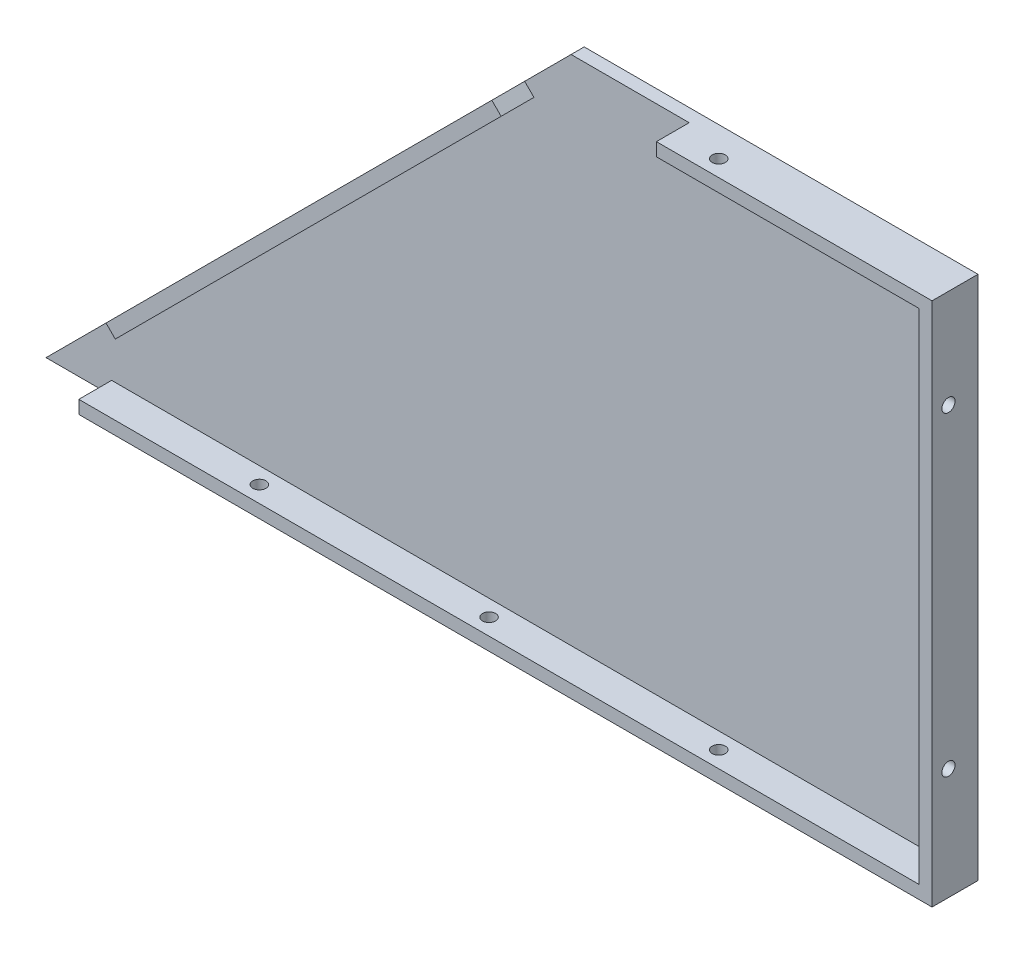
ISO-10303-21;
HEADER;
FILE_DESCRIPTION(('STEP AP214'),'2;1');
FILE_NAME('part.step','',(''),(''),'','','');
FILE_SCHEMA(('AUTOMOTIVE_DESIGN { 1 0 10303 214 1 1 1 1 }'));
ENDSEC;
DATA;
#1=APPLICATION_CONTEXT('core data for automotive mechanical design processes');
#2=APPLICATION_PROTOCOL_DEFINITION('international standard','automotive_design',2000,#1);
#3=PRODUCT_CONTEXT('',#1,'mechanical');
#4=PRODUCT('Part','Part','',(#3));
#5=PRODUCT_RELATED_PRODUCT_CATEGORY('part','',(#4));
#6=PRODUCT_DEFINITION_FORMATION('','',#4);
#7=PRODUCT_DEFINITION_CONTEXT('part definition',#1,'design');
#8=PRODUCT_DEFINITION('design','',#6,#7);
#9=PRODUCT_DEFINITION_SHAPE('','',#8);
#10=(LENGTH_UNIT() NAMED_UNIT(*) SI_UNIT(.MILLI.,.METRE.));
#11=(NAMED_UNIT(*) PLANE_ANGLE_UNIT() SI_UNIT($,.RADIAN.));
#12=(NAMED_UNIT(*) SI_UNIT($,.STERADIAN.) SOLID_ANGLE_UNIT());
#13=UNCERTAINTY_MEASURE_WITH_UNIT(LENGTH_MEASURE(1.E-05),#10,'distance_accuracy_value','');
#14=(GEOMETRIC_REPRESENTATION_CONTEXT(3) GLOBAL_UNCERTAINTY_ASSIGNED_CONTEXT((#13)) GLOBAL_UNIT_ASSIGNED_CONTEXT((#10,
#11,#12)) REPRESENTATION_CONTEXT('',''));
#15=CARTESIAN_POINT('',(0.,0.,0.));
#16=DIRECTION('',(0.,0.,1.));
#17=DIRECTION('',(1.,0.,0.));
#18=AXIS2_PLACEMENT_3D('',#15,#16,#17);
#19=CARTESIAN_POINT('',(0.,0.,0.));
#20=DIRECTION('',(0.,0.,1.));
#21=DIRECTION('',(-1.,0.,0.));
#22=AXIS2_PLACEMENT_3D('',#19,#20,#21);
#23=PLANE('',#22);
#24=DIRECTION('',(-0.707106781186544,0.707106781186551,0.));
#25=VECTOR('',#24,1.);
#26=CARTESIAN_POINT('',(-248.887301627792,25.4558441227155,0.));
#27=LINE('',#26,#25);
#28=CARTESIAN_POINT('',(-248.887301627792,25.4558441227155,0.));
#29=VERTEX_POINT('',#28);
#30=CARTESIAN_POINT('',(-251.715728752538,28.2842712474618,0.));
#31=VERTEX_POINT('',#30);
#32=EDGE_CURVE('E177',#29,#31,#27,.T.);
#33=ORIENTED_EDGE('',*,*,#32,.T.);
#34=DIRECTION('',(-0.707106781186551,-0.707106781186544,0.));
#35=VECTOR('',#34,1.);
#36=CARTESIAN_POINT('',(-280.,0.,0.));
#37=LINE('',#36,#35);
#38=CARTESIAN_POINT('',(-280.,0.,0.));
#39=VERTEX_POINT('',#38);
#40=EDGE_CURVE('E269',#31,#39,#37,.T.);
#41=ORIENTED_EDGE('',*,*,#40,.T.);
#42=DIRECTION('',(1.,0.,0.));
#43=VECTOR('',#42,1.);
#44=CARTESIAN_POINT('',(0.,0.,0.));
#45=LINE('',#44,#43);
#46=CARTESIAN_POINT('',(-260.,0.,0.));
#47=VERTEX_POINT('',#46);
#48=EDGE_CURVE('E259',#39,#47,#45,.T.);
#49=ORIENTED_EDGE('',*,*,#48,.T.);
#50=DIRECTION('',(0.,-1.,0.));
#51=VECTOR('',#50,1.);
#52=CARTESIAN_POINT('',(-260.,4.,0.));
#53=LINE('',#52,#51);
#54=CARTESIAN_POINT('',(-260.,4.,0.));
#55=VERTEX_POINT('',#54);
#56=EDGE_CURVE('E248',#55,#47,#53,.T.);
#57=ORIENTED_EDGE('',*,*,#56,.F.);
#58=DIRECTION('',(-1.,0.,0.));
#59=VECTOR('',#58,1.);
#60=CARTESIAN_POINT('',(-260.,4.,0.));
#61=LINE('',#60,#59);
#62=CARTESIAN_POINT('',(-4.,4.,0.));
#63=VERTEX_POINT('',#62);
#64=EDGE_CURVE('E242',#63,#55,#61,.T.);
#65=ORIENTED_EDGE('',*,*,#64,.F.);
#66=DIRECTION('',(0.,-1.,0.));
#67=VECTOR('',#66,1.);
#68=CARTESIAN_POINT('',(-4.,160.,0.));
#69=LINE('',#68,#67);
#70=CARTESIAN_POINT('',(-4.,156.,0.));
#71=VERTEX_POINT('',#70);
#72=EDGE_CURVE('E204',#71,#63,#69,.T.);
#73=ORIENTED_EDGE('',*,*,#72,.F.);
#74=DIRECTION('',(1.,0.,0.));
#75=VECTOR('',#74,1.);
#76=CARTESIAN_POINT('',(-84.,156.,0.));
#77=LINE('',#76,#75);
#78=CARTESIAN_POINT('',(-84.,156.,0.));
#79=VERTEX_POINT('',#78);
#80=EDGE_CURVE('E180',#79,#71,#77,.T.);
#81=ORIENTED_EDGE('',*,*,#80,.F.);
#82=DIRECTION('',(0.,1.,0.));
#83=VECTOR('',#82,1.);
#84=CARTESIAN_POINT('',(-84.,156.,0.));
#85=LINE('',#84,#83);
#86=CARTESIAN_POINT('',(-84.,160.,0.));
#87=VERTEX_POINT('',#86);
#88=EDGE_CURVE('E188',#79,#87,#85,.T.);
#89=ORIENTED_EDGE('',*,*,#88,.T.);
#90=DIRECTION('',(-1.,0.,0.));
#91=VECTOR('',#90,1.);
#92=CARTESIAN_POINT('',(-119.999999999998,160.,0.));
#93=LINE('',#92,#91);
#94=CARTESIAN_POINT('',(-119.999999999998,160.,0.));
#95=VERTEX_POINT('',#94);
#96=EDGE_CURVE('E250',#87,#95,#93,.T.);
#97=ORIENTED_EDGE('',*,*,#96,.T.);
#98=CARTESIAN_POINT('',(-134.142135623729,145.857864376269,0.));
#99=VERTEX_POINT('',#98);
#100=EDGE_CURVE('E163',#95,#99,#37,.T.);
#101=ORIENTED_EDGE('',*,*,#100,.T.);
#102=DIRECTION('',(-0.707106781186544,0.707106781186551,0.));
#103=VECTOR('',#102,1.);
#104=CARTESIAN_POINT('',(-131.313708498983,143.029437251523,0.));
#105=LINE('',#104,#103);
#106=CARTESIAN_POINT('',(-131.313708498983,143.029437251523,0.));
#107=VERTEX_POINT('',#106);
#108=EDGE_CURVE('E146',#107,#99,#105,.T.);
#109=ORIENTED_EDGE('',*,*,#108,.F.);
#110=DIRECTION('',(0.707106781186551,0.707106781186544,0.));
#111=VECTOR('',#110,1.);
#112=CARTESIAN_POINT('',(-131.313708498983,143.029437251523,0.));
#113=LINE('',#112,#111);
#114=EDGE_CURVE('E152',#29,#107,#113,.T.);
#115=ORIENTED_EDGE('',*,*,#114,.F.);
#116=EDGE_LOOP('',(#33,#41,#49,#57,#65,#73,#81,#89,#97,#101,#109,#115));
#117=FACE_BOUND('',#116,.T.);
#118=ADVANCED_FACE('F37',(#117),#23,.T.);
#119=CARTESIAN_POINT('',(0.,4.,0.));
#120=DIRECTION('',(0.,-1.,0.));
#121=DIRECTION('',(0.,0.,1.));
#122=AXIS2_PLACEMENT_3D('',#119,#120,#121);
#123=PLANE('',#122);
#124=CARTESIAN_POINT('',(-210.,4.,5.));
#125=DIRECTION('',(0.,1.,0.));
#126=DIRECTION('',(0.,0.,1.));
#127=AXIS2_PLACEMENT_3D('',#124,#125,#126);
#128=CIRCLE('',#127,2.);
#129=CARTESIAN_POINT('',(-210.,4.,7.));
#130=VERTEX_POINT('',#129);
#131=EDGE_CURVE('E230',#130,#130,#128,.T.);
#132=ORIENTED_EDGE('',*,*,#131,.F.);
#133=EDGE_LOOP('',(#132));
#134=FACE_BOUND('',#133,.T.);
#135=CARTESIAN_POINT('',(-140.,4.,5.));
#136=DIRECTION('',(0.,1.,0.));
#137=DIRECTION('',(0.,0.,1.));
#138=AXIS2_PLACEMENT_3D('',#135,#136,#137);
#139=CIRCLE('',#138,2.);
#140=CARTESIAN_POINT('',(-140.,4.,7.));
#141=VERTEX_POINT('',#140);
#142=EDGE_CURVE('E224',#141,#141,#139,.T.);
#143=ORIENTED_EDGE('',*,*,#142,.F.);
#144=EDGE_LOOP('',(#143));
#145=FACE_BOUND('',#144,.T.);
#146=CARTESIAN_POINT('',(-70.,4.,5.));
#147=DIRECTION('',(0.,1.,0.));
#148=DIRECTION('',(0.,0.,1.));
#149=AXIS2_PLACEMENT_3D('',#146,#147,#148);
#150=CIRCLE('',#149,2.);
#151=CARTESIAN_POINT('',(-70.,4.,7.));
#152=VERTEX_POINT('',#151);
#153=EDGE_CURVE('E218',#152,#152,#150,.T.);
#154=ORIENTED_EDGE('',*,*,#153,.F.);
#155=EDGE_LOOP('',(#154));
#156=FACE_BOUND('',#155,.T.);
#157=DIRECTION('',(0.,0.,1.));
#158=VECTOR('',#157,1.);
#159=CARTESIAN_POINT('',(-4.,4.,0.));
#160=LINE('',#159,#158);
#161=CARTESIAN_POINT('',(-4.,4.,10.));
#162=VERTEX_POINT('',#161);
#163=EDGE_CURVE('E209',#63,#162,#160,.T.);
#164=ORIENTED_EDGE('',*,*,#163,.F.);
#165=ORIENTED_EDGE('',*,*,#64,.T.);
#166=DIRECTION('',(0.,0.,1.));
#167=VECTOR('',#166,1.);
#168=CARTESIAN_POINT('',(-260.,4.,0.));
#169=LINE('',#168,#167);
#170=CARTESIAN_POINT('',(-260.,4.,10.));
#171=VERTEX_POINT('',#170);
#172=EDGE_CURVE('E235',#55,#171,#169,.T.);
#173=ORIENTED_EDGE('',*,*,#172,.T.);
#174=DIRECTION('',(1.,0.,0.));
#175=VECTOR('',#174,1.);
#176=CARTESIAN_POINT('',(-260.,4.,10.));
#177=LINE('',#176,#175);
#178=EDGE_CURVE('E238',#171,#162,#177,.T.);
#179=ORIENTED_EDGE('',*,*,#178,.T.);
#180=EDGE_LOOP('',(#164,#165,#173,#179));
#181=FACE_BOUND('',#180,.T.);
#182=ADVANCED_FACE('F353',(#134,#145,#156,#181),#123,.F.);
#183=CARTESIAN_POINT('',(0.,160.,-4.));
#184=DIRECTION('',(-1.,0.,0.));
#185=DIRECTION('',(0.,-1.,0.));
#186=AXIS2_PLACEMENT_3D('',#183,#184,#185);
#187=PLANE('',#186);
#188=DIRECTION('',(0.,-1.,0.));
#189=VECTOR('',#188,1.);
#190=CARTESIAN_POINT('',(0.,4.,10.));
#191=LINE('',#190,#189);
#192=CARTESIAN_POINT('',(0.,160.,9.99999999999998));
#193=VERTEX_POINT('',#192);
#194=CARTESIAN_POINT('',(0.,0.,10.));
#195=VERTEX_POINT('',#194);
#196=EDGE_CURVE('E251',#193,#195,#191,.T.);
#197=ORIENTED_EDGE('',*,*,#196,.T.);
#198=DIRECTION('',(0.,0.,1.));
#199=VECTOR('',#198,1.);
#200=CARTESIAN_POINT('',(0.,0.,-4.));
#201=LINE('',#200,#199);
#202=CARTESIAN_POINT('',(0.,0.,-4.));
#203=VERTEX_POINT('',#202);
#204=EDGE_CURVE('E267',#203,#195,#201,.T.);
#205=ORIENTED_EDGE('',*,*,#204,.F.);
#206=DIRECTION('',(0.,1.,0.));
#207=VECTOR('',#206,1.);
#208=CARTESIAN_POINT('',(0.,160.,-4.));
#209=LINE('',#208,#207);
#210=CARTESIAN_POINT('',(0.,160.,-4.));
#211=VERTEX_POINT('',#210);
#212=EDGE_CURVE('E255',#203,#211,#209,.T.);
#213=ORIENTED_EDGE('',*,*,#212,.T.);
#214=DIRECTION('',(0.,0.,1.));
#215=VECTOR('',#214,1.);
#216=CARTESIAN_POINT('',(0.,160.,-4.));
#217=LINE('',#216,#215);
#218=EDGE_CURVE('E11',#211,#193,#217,.T.);
#219=ORIENTED_EDGE('',*,*,#218,.T.);
#220=EDGE_LOOP('',(#197,#205,#213,#219));
#221=FACE_BOUND('',#220,.T.);
#222=CARTESIAN_POINT('',(0.,130.,4.99999999999999));
#223=DIRECTION('',(-1.,0.,0.));
#224=DIRECTION('',(0.,1.,0.));
#225=AXIS2_PLACEMENT_3D('',#222,#223,#224);
#226=CIRCLE('',#225,2.);
#227=CARTESIAN_POINT('',(0.,132.,4.99999999999999));
#228=VERTEX_POINT('',#227);
#229=EDGE_CURVE('E192',#228,#228,#226,.T.);
#230=ORIENTED_EDGE('',*,*,#229,.T.);
#231=EDGE_LOOP('',(#230));
#232=FACE_BOUND('',#231,.T.);
#233=CARTESIAN_POINT('',(0.,34.,5.));
#234=DIRECTION('',(-1.,0.,0.));
#235=DIRECTION('',(0.,1.,0.));
#236=AXIS2_PLACEMENT_3D('',#233,#234,#235);
#237=CIRCLE('',#236,2.);
#238=CARTESIAN_POINT('',(0.,36.,5.));
#239=VERTEX_POINT('',#238);
#240=EDGE_CURVE('E198',#239,#239,#237,.T.);
#241=ORIENTED_EDGE('',*,*,#240,.T.);
#242=EDGE_LOOP('',(#241));
#243=FACE_BOUND('',#242,.T.);
#244=ADVANCED_FACE('F39',(#221,#232,#243),#187,.F.);
#245=CARTESIAN_POINT('',(-119.999999999998,160.,-4.));
#246=DIRECTION('',(0.,-1.,0.));
#247=DIRECTION('',(0.,0.,1.));
#248=AXIS2_PLACEMENT_3D('',#245,#246,#247);
#249=PLANE('',#248);
#250=DIRECTION('',(0.,0.,-1.));
#251=VECTOR('',#250,1.);
#252=CARTESIAN_POINT('',(-84.,160.,0.));
#253=LINE('',#252,#251);
#254=CARTESIAN_POINT('',(-84.,160.,10.));
#255=VERTEX_POINT('',#254);
#256=EDGE_CURVE('E173',#255,#87,#253,.T.);
#257=ORIENTED_EDGE('',*,*,#256,.F.);
#258=DIRECTION('',(1.,0.,0.));
#259=VECTOR('',#258,1.);
#260=CARTESIAN_POINT('',(-4.,160.,9.99999999999998));
#261=LINE('',#260,#259);
#262=EDGE_CURVE('E215',#255,#193,#261,.T.);
#263=ORIENTED_EDGE('',*,*,#262,.T.);
#264=ORIENTED_EDGE('',*,*,#218,.F.);
#265=DIRECTION('',(-1.,0.,0.));
#266=VECTOR('',#265,1.);
#267=CARTESIAN_POINT('',(-119.999999999998,160.,-4.));
#268=LINE('',#267,#266);
#269=CARTESIAN_POINT('',(-119.999999999998,160.,-4.));
#270=VERTEX_POINT('',#269);
#271=EDGE_CURVE('E258',#211,#270,#268,.T.);
#272=ORIENTED_EDGE('',*,*,#271,.T.);
#273=DIRECTION('',(0.,0.,1.));
#274=VECTOR('',#273,1.);
#275=CARTESIAN_POINT('',(-119.999999999998,160.,-4.));
#276=LINE('',#275,#274);
#277=EDGE_CURVE('E45',#270,#95,#276,.T.);
#278=ORIENTED_EDGE('',*,*,#277,.T.);
#279=ORIENTED_EDGE('',*,*,#96,.F.);
#280=EDGE_LOOP('',(#257,#263,#264,#272,#278,#279));
#281=FACE_BOUND('',#280,.T.);
#282=CARTESIAN_POINT('',(-70.,160.,5.));
#283=DIRECTION('',(0.,-1.,0.));
#284=DIRECTION('',(0.,0.,-1.));
#285=AXIS2_PLACEMENT_3D('',#282,#283,#284);
#286=CIRCLE('',#285,2.);
#287=CARTESIAN_POINT('',(-70.,160.,3.));
#288=VERTEX_POINT('',#287);
#289=EDGE_CURVE('E174',#288,#288,#286,.T.);
#290=ORIENTED_EDGE('',*,*,#289,.T.);
#291=EDGE_LOOP('',(#290));
#292=FACE_BOUND('',#291,.T.);
#293=ADVANCED_FACE('F280',(#281,#292),#249,.F.);
#294=CARTESIAN_POINT('',(-280.,0.,-4.));
#295=DIRECTION('',(0.707106781186544,-0.707106781186551,0.));
#296=DIRECTION('',(0.707106781186551,0.707106781186544,0.));
#297=AXIS2_PLACEMENT_3D('',#294,#295,#296);
#298=PLANE('',#297);
#299=ORIENTED_EDGE('',*,*,#100,.F.);
#300=ORIENTED_EDGE('',*,*,#277,.F.);
#301=DIRECTION('',(-0.707106781186551,-0.707106781186544,0.));
#302=VECTOR('',#301,1.);
#303=CARTESIAN_POINT('',(-280.,0.,-4.));
#304=LINE('',#303,#302);
#305=CARTESIAN_POINT('',(-280.,0.,-4.));
#306=VERTEX_POINT('',#305);
#307=EDGE_CURVE('E262',#270,#306,#304,.T.);
#308=ORIENTED_EDGE('',*,*,#307,.T.);
#309=DIRECTION('',(0.,0.,1.));
#310=VECTOR('',#309,1.);
#311=CARTESIAN_POINT('',(-280.,0.,-4.));
#312=LINE('',#311,#310);
#313=EDGE_CURVE('E275',#306,#39,#312,.T.);
#314=ORIENTED_EDGE('',*,*,#313,.T.);
#315=ORIENTED_EDGE('',*,*,#40,.F.);
#316=DIRECTION('',(0.,0.,-1.));
#317=VECTOR('',#316,1.);
#318=CARTESIAN_POINT('',(-251.715728752538,28.2842712474617,0.));
#319=LINE('',#318,#317);
#320=CARTESIAN_POINT('',(-251.715728752538,28.2842712474617,10.));
#321=VERTEX_POINT('',#320);
#322=EDGE_CURVE('E52',#321,#31,#319,.T.);
#323=ORIENTED_EDGE('',*,*,#322,.F.);
#324=DIRECTION('',(-0.707106781186551,-0.707106781186544,0.));
#325=VECTOR('',#324,1.);
#326=CARTESIAN_POINT('',(-134.142135623729,145.857864376269,10.));
#327=LINE('',#326,#325);
#328=CARTESIAN_POINT('',(-134.142135623729,145.857864376269,10.));
#329=VERTEX_POINT('',#328);
#330=EDGE_CURVE('E313',#329,#321,#327,.T.);
#331=ORIENTED_EDGE('',*,*,#330,.F.);
#332=DIRECTION('',(0.,0.,1.));
#333=VECTOR('',#332,1.);
#334=CARTESIAN_POINT('',(-134.142135623729,145.857864376269,0.));
#335=LINE('',#334,#333);
#336=EDGE_CURVE('E287',#99,#329,#335,.T.);
#337=ORIENTED_EDGE('',*,*,#336,.F.);
#338=EDGE_LOOP('',(#299,#300,#308,#314,#315,#323,#331,#337));
#339=FACE_BOUND('',#338,.T.);
#340=CARTESIAN_POINT('',(-237.573593128807,42.4264068711926,5.));
#341=DIRECTION('',(0.707106781186544,-0.707106781186551,0.));
#342=DIRECTION('',(-0.707106781186551,-0.707106781186544,0.));
#343=AXIS2_PLACEMENT_3D('',#340,#341,#342);
#344=CIRCLE('',#343,2.);
#345=CARTESIAN_POINT('',(-238.98780669118,41.0121933088195,5.));
#346=VERTEX_POINT('',#345);
#347=EDGE_CURVE('E325',#346,#346,#344,.T.);
#348=ORIENTED_EDGE('',*,*,#347,.T.);
#349=EDGE_LOOP('',(#348));
#350=FACE_BOUND('',#349,.T.);
#351=CARTESIAN_POINT('',(-148.28427124746,131.715728752538,5.));
#352=DIRECTION('',(0.707106781186544,-0.707106781186551,0.));
#353=DIRECTION('',(-0.707106781186551,-0.707106781186544,0.));
#354=AXIS2_PLACEMENT_3D('',#351,#352,#353);
#355=CIRCLE('',#354,2.);
#356=CARTESIAN_POINT('',(-149.698484809833,130.301515190165,5.));
#357=VERTEX_POINT('',#356);
#358=EDGE_CURVE('E319',#357,#357,#355,.T.);
#359=ORIENTED_EDGE('',*,*,#358,.T.);
#360=EDGE_LOOP('',(#359));
#361=FACE_BOUND('',#360,.T.);
#362=ADVANCED_FACE('F284',(#339,#350,#361),#298,.F.);
#363=CARTESIAN_POINT('',(0.,0.,-4.));
#364=DIRECTION('',(0.,1.,0.));
#365=DIRECTION('',(-1.,0.,0.));
#366=AXIS2_PLACEMENT_3D('',#363,#364,#365);
#367=PLANE('',#366);
#368=ORIENTED_EDGE('',*,*,#48,.F.);
#369=ORIENTED_EDGE('',*,*,#313,.F.);
#370=DIRECTION('',(1.,0.,0.));
#371=VECTOR('',#370,1.);
#372=CARTESIAN_POINT('',(0.,0.,-4.));
#373=LINE('',#372,#371);
#374=EDGE_CURVE('E265',#306,#203,#373,.T.);
#375=ORIENTED_EDGE('',*,*,#374,.T.);
#376=ORIENTED_EDGE('',*,*,#204,.T.);
#377=DIRECTION('',(1.,0.,0.));
#378=VECTOR('',#377,1.);
#379=CARTESIAN_POINT('',(-260.,0.,10.));
#380=LINE('',#379,#378);
#381=CARTESIAN_POINT('',(-260.,0.,10.));
#382=VERTEX_POINT('',#381);
#383=EDGE_CURVE('E239',#382,#195,#380,.T.);
#384=ORIENTED_EDGE('',*,*,#383,.F.);
#385=DIRECTION('',(0.,0.,1.));
#386=VECTOR('',#385,1.);
#387=CARTESIAN_POINT('',(-260.,0.,0.));
#388=LINE('',#387,#386);
#389=EDGE_CURVE('E60',#47,#382,#388,.T.);
#390=ORIENTED_EDGE('',*,*,#389,.F.);
#391=EDGE_LOOP('',(#368,#369,#375,#376,#384,#390));
#392=FACE_BOUND('',#391,.T.);
#393=CARTESIAN_POINT('',(-70.,0.,5.));
#394=DIRECTION('',(0.,1.,0.));
#395=DIRECTION('',(0.,0.,1.));
#396=AXIS2_PLACEMENT_3D('',#393,#394,#395);
#397=CIRCLE('',#396,2.);
#398=CARTESIAN_POINT('',(-70.,0.,7.));
#399=VERTEX_POINT('',#398);
#400=EDGE_CURVE('E217',#399,#399,#397,.T.);
#401=ORIENTED_EDGE('',*,*,#400,.T.);
#402=EDGE_LOOP('',(#401));
#403=FACE_BOUND('',#402,.T.);
#404=CARTESIAN_POINT('',(-140.,0.,5.));
#405=DIRECTION('',(0.,1.,0.));
#406=DIRECTION('',(0.,0.,1.));
#407=AXIS2_PLACEMENT_3D('',#404,#405,#406);
#408=CIRCLE('',#407,2.);
#409=CARTESIAN_POINT('',(-140.,0.,7.));
#410=VERTEX_POINT('',#409);
#411=EDGE_CURVE('E221',#410,#410,#408,.T.);
#412=ORIENTED_EDGE('',*,*,#411,.T.);
#413=EDGE_LOOP('',(#412));
#414=FACE_BOUND('',#413,.T.);
#415=CARTESIAN_POINT('',(-210.,0.,5.));
#416=DIRECTION('',(0.,1.,0.));
#417=DIRECTION('',(0.,0.,1.));
#418=AXIS2_PLACEMENT_3D('',#415,#416,#417);
#419=CIRCLE('',#418,2.);
#420=CARTESIAN_POINT('',(-210.,0.,7.));
#421=VERTEX_POINT('',#420);
#422=EDGE_CURVE('E227',#421,#421,#419,.T.);
#423=ORIENTED_EDGE('',*,*,#422,.T.);
#424=EDGE_LOOP('',(#423));
#425=FACE_BOUND('',#424,.T.);
#426=ADVANCED_FACE('F303',(#392,#403,#414,#425),#367,.F.);
#427=CARTESIAN_POINT('',(0.,0.,-4.));
#428=DIRECTION('',(0.,0.,1.));
#429=DIRECTION('',(-1.,0.,0.));
#430=AXIS2_PLACEMENT_3D('',#427,#428,#429);
#431=PLANE('',#430);
#432=ORIENTED_EDGE('',*,*,#212,.F.);
#433=ORIENTED_EDGE('',*,*,#374,.F.);
#434=ORIENTED_EDGE('',*,*,#307,.F.);
#435=ORIENTED_EDGE('',*,*,#271,.F.);
#436=EDGE_LOOP('',(#432,#433,#434,#435));
#437=FACE_BOUND('',#436,.T.);
#438=ADVANCED_FACE('F307',(#437),#431,.F.);
#439=CARTESIAN_POINT('',(-260.,4.,0.));
#440=DIRECTION('',(-1.,0.,0.));
#441=DIRECTION('',(0.,0.,-1.));
#442=AXIS2_PLACEMENT_3D('',#439,#440,#441);
#443=PLANE('',#442);
#444=ORIENTED_EDGE('',*,*,#389,.T.);
#445=DIRECTION('',(0.,-1.,0.));
#446=VECTOR('',#445,1.);
#447=CARTESIAN_POINT('',(-260.,4.,10.));
#448=LINE('',#447,#446);
#449=EDGE_CURVE('E245',#171,#382,#448,.T.);
#450=ORIENTED_EDGE('',*,*,#449,.F.);
#451=ORIENTED_EDGE('',*,*,#172,.F.);
#452=ORIENTED_EDGE('',*,*,#56,.T.);
#453=EDGE_LOOP('',(#444,#450,#451,#452));
#454=FACE_BOUND('',#453,.T.);
#455=ADVANCED_FACE('F363',(#454),#443,.T.);
#456=CARTESIAN_POINT('',(-260.,4.,10.));
#457=DIRECTION('',(0.,0.,1.));
#458=DIRECTION('',(-1.,0.,0.));
#459=AXIS2_PLACEMENT_3D('',#456,#457,#458);
#460=PLANE('',#459);
#461=ORIENTED_EDGE('',*,*,#383,.T.);
#462=ORIENTED_EDGE('',*,*,#196,.F.);
#463=ORIENTED_EDGE('',*,*,#262,.F.);
#464=DIRECTION('',(0.,1.,0.));
#465=VECTOR('',#464,1.);
#466=CARTESIAN_POINT('',(-84.,156.,10.));
#467=LINE('',#466,#465);
#468=CARTESIAN_POINT('',(-84.,156.,10.));
#469=VERTEX_POINT('',#468);
#470=EDGE_CURVE('E190',#469,#255,#467,.T.);
#471=ORIENTED_EDGE('',*,*,#470,.F.);
#472=DIRECTION('',(-1.,0.,0.));
#473=VECTOR('',#472,1.);
#474=CARTESIAN_POINT('',(-84.,156.,10.));
#475=LINE('',#474,#473);
#476=CARTESIAN_POINT('',(-4.,156.,10.));
#477=VERTEX_POINT('',#476);
#478=EDGE_CURVE('E185',#477,#469,#475,.T.);
#479=ORIENTED_EDGE('',*,*,#478,.F.);
#480=DIRECTION('',(0.,1.,0.));
#481=VECTOR('',#480,1.);
#482=CARTESIAN_POINT('',(-4.,160.,9.99999999999998));
#483=LINE('',#482,#481);
#484=EDGE_CURVE('E212',#162,#477,#483,.T.);
#485=ORIENTED_EDGE('',*,*,#484,.F.);
#486=ORIENTED_EDGE('',*,*,#178,.F.);
#487=ORIENTED_EDGE('',*,*,#449,.T.);
#488=EDGE_LOOP('',(#461,#462,#463,#471,#479,#485,#486,#487));
#489=FACE_BOUND('',#488,.T.);
#490=ADVANCED_FACE('F301',(#489),#460,.T.);
#491=CARTESIAN_POINT('',(-210.,4.,5.));
#492=DIRECTION('',(0.,-1.,0.));
#493=DIRECTION('',(0.,0.,1.));
#494=AXIS2_PLACEMENT_3D('',#491,#492,#493);
#495=CYLINDRICAL_SURFACE('',#494,2.);
#496=ORIENTED_EDGE('',*,*,#131,.T.);
#497=EDGE_LOOP('',(#496));
#498=FACE_BOUND('',#497,.T.);
#499=ORIENTED_EDGE('',*,*,#422,.F.);
#500=EDGE_LOOP('',(#499));
#501=FACE_BOUND('',#500,.T.);
#502=ADVANCED_FACE('F368',(#498,#501),#495,.F.);
#503=CARTESIAN_POINT('',(-140.,4.,5.));
#504=DIRECTION('',(0.,-1.,0.));
#505=DIRECTION('',(0.,0.,1.));
#506=AXIS2_PLACEMENT_3D('',#503,#504,#505);
#507=CYLINDRICAL_SURFACE('',#506,2.);
#508=ORIENTED_EDGE('',*,*,#142,.T.);
#509=EDGE_LOOP('',(#508));
#510=FACE_BOUND('',#509,.T.);
#511=ORIENTED_EDGE('',*,*,#411,.F.);
#512=EDGE_LOOP('',(#511));
#513=FACE_BOUND('',#512,.T.);
#514=ADVANCED_FACE('F372',(#510,#513),#507,.F.);
#515=CARTESIAN_POINT('',(-70.,4.,5.));
#516=DIRECTION('',(0.,-1.,0.));
#517=DIRECTION('',(0.,0.,1.));
#518=AXIS2_PLACEMENT_3D('',#515,#516,#517);
#519=CYLINDRICAL_SURFACE('',#518,2.);
#520=ORIENTED_EDGE('',*,*,#153,.T.);
#521=EDGE_LOOP('',(#520));
#522=FACE_BOUND('',#521,.T.);
#523=ORIENTED_EDGE('',*,*,#400,.F.);
#524=EDGE_LOOP('',(#523));
#525=FACE_BOUND('',#524,.T.);
#526=ADVANCED_FACE('F376',(#522,#525),#519,.F.);
#527=CARTESIAN_POINT('',(-4.,0.,0.));
#528=DIRECTION('',(1.,0.,0.));
#529=DIRECTION('',(0.,1.,0.));
#530=AXIS2_PLACEMENT_3D('',#527,#528,#529);
#531=PLANE('',#530);
#532=CARTESIAN_POINT('',(-4.,130.,4.99999999999999));
#533=DIRECTION('',(-1.,0.,0.));
#534=DIRECTION('',(0.,1.,0.));
#535=AXIS2_PLACEMENT_3D('',#532,#533,#534);
#536=CIRCLE('',#535,2.);
#537=CARTESIAN_POINT('',(-4.,132.,4.99999999999999));
#538=VERTEX_POINT('',#537);
#539=EDGE_CURVE('E195',#538,#538,#536,.T.);
#540=ORIENTED_EDGE('',*,*,#539,.F.);
#541=EDGE_LOOP('',(#540));
#542=FACE_BOUND('',#541,.T.);
#543=CARTESIAN_POINT('',(-4.,34.,5.));
#544=DIRECTION('',(-1.,0.,0.));
#545=DIRECTION('',(0.,1.,0.));
#546=AXIS2_PLACEMENT_3D('',#543,#544,#545);
#547=CIRCLE('',#546,2.);
#548=CARTESIAN_POINT('',(-4.,36.,5.));
#549=VERTEX_POINT('',#548);
#550=EDGE_CURVE('E201',#549,#549,#547,.T.);
#551=ORIENTED_EDGE('',*,*,#550,.F.);
#552=EDGE_LOOP('',(#551));
#553=FACE_BOUND('',#552,.T.);
#554=ORIENTED_EDGE('',*,*,#72,.T.);
#555=ORIENTED_EDGE('',*,*,#163,.T.);
#556=ORIENTED_EDGE('',*,*,#484,.T.);
#557=DIRECTION('',(0.,0.,1.));
#558=VECTOR('',#557,1.);
#559=CARTESIAN_POINT('',(-4.,156.,0.));
#560=LINE('',#559,#558);
#561=EDGE_CURVE('E183',#71,#477,#560,.T.);
#562=ORIENTED_EDGE('',*,*,#561,.F.);
#563=EDGE_LOOP('',(#554,#555,#556,#562));
#564=FACE_BOUND('',#563,.T.);
#565=ADVANCED_FACE('F380',(#542,#553,#564),#531,.F.);
#566=CARTESIAN_POINT('',(-4.,34.,5.));
#567=DIRECTION('',(1.,0.,0.));
#568=DIRECTION('',(0.,1.,0.));
#569=AXIS2_PLACEMENT_3D('',#566,#567,#568);
#570=CYLINDRICAL_SURFACE('',#569,2.);
#571=ORIENTED_EDGE('',*,*,#550,.T.);
#572=EDGE_LOOP('',(#571));
#573=FACE_BOUND('',#572,.T.);
#574=ORIENTED_EDGE('',*,*,#240,.F.);
#575=EDGE_LOOP('',(#574));
#576=FACE_BOUND('',#575,.T.);
#577=ADVANCED_FACE('F384',(#573,#576),#570,.F.);
#578=CARTESIAN_POINT('',(-4.,130.,4.99999999999999));
#579=DIRECTION('',(1.,0.,0.));
#580=DIRECTION('',(0.,1.,0.));
#581=AXIS2_PLACEMENT_3D('',#578,#579,#580);
#582=CYLINDRICAL_SURFACE('',#581,2.);
#583=ORIENTED_EDGE('',*,*,#539,.T.);
#584=EDGE_LOOP('',(#583));
#585=FACE_BOUND('',#584,.T.);
#586=ORIENTED_EDGE('',*,*,#229,.F.);
#587=EDGE_LOOP('',(#586));
#588=FACE_BOUND('',#587,.T.);
#589=ADVANCED_FACE('F388',(#585,#588),#582,.F.);
#590=CARTESIAN_POINT('',(-84.,156.,0.));
#591=DIRECTION('',(-1.,0.,0.));
#592=DIRECTION('',(0.,0.,-1.));
#593=AXIS2_PLACEMENT_3D('',#590,#591,#592);
#594=PLANE('',#593);
#595=ORIENTED_EDGE('',*,*,#256,.T.);
#596=ORIENTED_EDGE('',*,*,#88,.F.);
#597=DIRECTION('',(0.,0.,-1.));
#598=VECTOR('',#597,1.);
#599=CARTESIAN_POINT('',(-84.,156.,0.));
#600=LINE('',#599,#598);
#601=EDGE_CURVE('E178',#469,#79,#600,.T.);
#602=ORIENTED_EDGE('',*,*,#601,.F.);
#603=ORIENTED_EDGE('',*,*,#470,.T.);
#604=EDGE_LOOP('',(#595,#596,#602,#603));
#605=FACE_BOUND('',#604,.T.);
#606=ADVANCED_FACE('F292',(#605),#594,.T.);
#607=CARTESIAN_POINT('',(0.,156.,0.));
#608=DIRECTION('',(0.,-1.,0.));
#609=DIRECTION('',(0.,0.,1.));
#610=AXIS2_PLACEMENT_3D('',#607,#608,#609);
#611=PLANE('',#610);
#612=CARTESIAN_POINT('',(-70.,156.,5.));
#613=DIRECTION('',(0.,-1.,0.));
#614=DIRECTION('',(0.,0.,-1.));
#615=AXIS2_PLACEMENT_3D('',#612,#613,#614);
#616=CIRCLE('',#615,2.);
#617=CARTESIAN_POINT('',(-70.,156.,3.));
#618=VERTEX_POINT('',#617);
#619=EDGE_CURVE('E170',#618,#618,#616,.T.);
#620=ORIENTED_EDGE('',*,*,#619,.F.);
#621=EDGE_LOOP('',(#620));
#622=FACE_BOUND('',#621,.T.);
#623=ORIENTED_EDGE('',*,*,#601,.T.);
#624=ORIENTED_EDGE('',*,*,#80,.T.);
#625=ORIENTED_EDGE('',*,*,#561,.T.);
#626=ORIENTED_EDGE('',*,*,#478,.T.);
#627=EDGE_LOOP('',(#623,#624,#625,#626));
#628=FACE_BOUND('',#627,.T.);
#629=ADVANCED_FACE('F395',(#622,#628),#611,.T.);
#630=CARTESIAN_POINT('',(-70.,156.,5.));
#631=DIRECTION('',(0.,1.,0.));
#632=DIRECTION('',(0.,0.,-1.));
#633=AXIS2_PLACEMENT_3D('',#630,#631,#632);
#634=CYLINDRICAL_SURFACE('',#633,2.);
#635=ORIENTED_EDGE('',*,*,#619,.T.);
#636=EDGE_LOOP('',(#635));
#637=FACE_BOUND('',#636,.T.);
#638=ORIENTED_EDGE('',*,*,#289,.F.);
#639=EDGE_LOOP('',(#638));
#640=FACE_BOUND('',#639,.T.);
#641=ADVANCED_FACE('F398',(#637,#640),#634,.F.);
#642=CARTESIAN_POINT('',(-248.887301627792,25.4558441227155,0.));
#643=DIRECTION('',(-0.707106781186551,-0.707106781186544,0.));
#644=DIRECTION('',(0.707106781186544,-0.707106781186551,0.));
#645=AXIS2_PLACEMENT_3D('',#642,#643,#644);
#646=PLANE('',#645);
#647=ORIENTED_EDGE('',*,*,#322,.T.);
#648=ORIENTED_EDGE('',*,*,#32,.F.);
#649=DIRECTION('',(0.,0.,-1.));
#650=VECTOR('',#649,1.);
#651=CARTESIAN_POINT('',(-248.887301627792,25.4558441227155,0.));
#652=LINE('',#651,#650);
#653=CARTESIAN_POINT('',(-248.887301627792,25.4558441227155,10.));
#654=VERTEX_POINT('',#653);
#655=EDGE_CURVE('E157',#654,#29,#652,.T.);
#656=ORIENTED_EDGE('',*,*,#655,.F.);
#657=DIRECTION('',(-0.707106781186544,0.707106781186551,0.));
#658=VECTOR('',#657,1.);
#659=CARTESIAN_POINT('',(-248.887301627792,25.4558441227155,10.));
#660=LINE('',#659,#658);
#661=EDGE_CURVE('E165',#654,#321,#660,.T.);
#662=ORIENTED_EDGE('',*,*,#661,.T.);
#663=EDGE_LOOP('',(#647,#648,#656,#662));
#664=FACE_BOUND('',#663,.T.);
#665=ADVANCED_FACE('F402',(#664),#646,.T.);
#666=CARTESIAN_POINT('',(-131.313708498983,143.029437251523,10.));
#667=DIRECTION('',(0.,0.,1.));
#668=DIRECTION('',(-1.,0.,0.));
#669=AXIS2_PLACEMENT_3D('',#666,#667,#668);
#670=PLANE('',#669);
#671=ORIENTED_EDGE('',*,*,#330,.T.);
#672=ORIENTED_EDGE('',*,*,#661,.F.);
#673=DIRECTION('',(-0.707106781186551,-0.707106781186544,0.));
#674=VECTOR('',#673,1.);
#675=CARTESIAN_POINT('',(-131.313708498983,143.029437251523,10.));
#676=LINE('',#675,#674);
#677=CARTESIAN_POINT('',(-131.313708498983,143.029437251523,10.));
#678=VERTEX_POINT('',#677);
#679=EDGE_CURVE('E151',#678,#654,#676,.T.);
#680=ORIENTED_EDGE('',*,*,#679,.F.);
#681=DIRECTION('',(-0.707106781186544,0.707106781186551,0.));
#682=VECTOR('',#681,1.);
#683=CARTESIAN_POINT('',(-131.313708498983,143.029437251523,10.));
#684=LINE('',#683,#682);
#685=EDGE_CURVE('E148',#678,#329,#684,.T.);
#686=ORIENTED_EDGE('',*,*,#685,.T.);
#687=EDGE_LOOP('',(#671,#672,#680,#686));
#688=FACE_BOUND('',#687,.T.);
#689=ADVANCED_FACE('F406',(#688),#670,.T.);
#690=CARTESIAN_POINT('',(-131.313708498983,143.029437251523,0.));
#691=DIRECTION('',(0.707106781186551,0.707106781186544,0.));
#692=DIRECTION('',(-0.707106781186544,0.707106781186551,0.));
#693=AXIS2_PLACEMENT_3D('',#690,#691,#692);
#694=PLANE('',#693);
#695=ORIENTED_EDGE('',*,*,#336,.T.);
#696=ORIENTED_EDGE('',*,*,#685,.F.);
#697=DIRECTION('',(0.,0.,1.));
#698=VECTOR('',#697,1.);
#699=CARTESIAN_POINT('',(-131.313708498983,143.029437251523,0.));
#700=LINE('',#699,#698);
#701=EDGE_CURVE('E141',#107,#678,#700,.T.);
#702=ORIENTED_EDGE('',*,*,#701,.F.);
#703=ORIENTED_EDGE('',*,*,#108,.T.);
#704=EDGE_LOOP('',(#695,#696,#702,#703));
#705=FACE_BOUND('',#704,.T.);
#706=ADVANCED_FACE('F144',(#705),#694,.T.);
#707=CARTESIAN_POINT('',(-137.171572875252,137.171572875254,0.));
#708=DIRECTION('',(0.707106781186544,-0.707106781186551,0.));
#709=DIRECTION('',(0.707106781186551,0.707106781186544,0.));
#710=AXIS2_PLACEMENT_3D('',#707,#708,#709);
#711=PLANE('',#710);
#712=CARTESIAN_POINT('',(-234.745166004061,39.5979797464464,5.));
#713=DIRECTION('',(0.707106781186544,-0.707106781186551,0.));
#714=DIRECTION('',(-0.707106781186551,-0.707106781186544,0.));
#715=AXIS2_PLACEMENT_3D('',#712,#713,#714);
#716=CIRCLE('',#715,2.);
#717=CARTESIAN_POINT('',(-236.159379566434,38.1837661840733,5.));
#718=VERTEX_POINT('',#717);
#719=EDGE_CURVE('E322',#718,#718,#716,.T.);
#720=ORIENTED_EDGE('',*,*,#719,.F.);
#721=EDGE_LOOP('',(#720));
#722=FACE_BOUND('',#721,.T.);
#723=CARTESIAN_POINT('',(-145.455844122714,128.887301627792,5.));
#724=DIRECTION('',(0.707106781186544,-0.707106781186551,0.));
#725=DIRECTION('',(-0.707106781186551,-0.707106781186544,0.));
#726=AXIS2_PLACEMENT_3D('',#723,#724,#725);
#727=CIRCLE('',#726,2.);
#728=CARTESIAN_POINT('',(-146.870057685087,127.473088065419,5.));
#729=VERTEX_POINT('',#728);
#730=EDGE_CURVE('E316',#729,#729,#727,.T.);
#731=ORIENTED_EDGE('',*,*,#730,.F.);
#732=EDGE_LOOP('',(#731));
#733=FACE_BOUND('',#732,.T.);
#734=ORIENTED_EDGE('',*,*,#114,.T.);
#735=ORIENTED_EDGE('',*,*,#701,.T.);
#736=ORIENTED_EDGE('',*,*,#679,.T.);
#737=ORIENTED_EDGE('',*,*,#655,.T.);
#738=EDGE_LOOP('',(#734,#735,#736,#737));
#739=FACE_BOUND('',#738,.T.);
#740=ADVANCED_FACE('F155',(#722,#733,#739),#711,.T.);
#741=CARTESIAN_POINT('',(-145.455844122714,128.887301627792,5.));
#742=DIRECTION('',(-0.707106781186544,0.707106781186551,0.));
#743=DIRECTION('',(-0.707106781186551,-0.707106781186544,0.));
#744=AXIS2_PLACEMENT_3D('',#741,#742,#743);
#745=CYLINDRICAL_SURFACE('',#744,2.);
#746=ORIENTED_EDGE('',*,*,#730,.T.);
#747=EDGE_LOOP('',(#746));
#748=FACE_BOUND('',#747,.T.);
#749=ORIENTED_EDGE('',*,*,#358,.F.);
#750=EDGE_LOOP('',(#749));
#751=FACE_BOUND('',#750,.T.);
#752=ADVANCED_FACE('F336',(#748,#751),#745,.F.);
#753=CARTESIAN_POINT('',(-234.745166004061,39.5979797464464,5.));
#754=DIRECTION('',(-0.707106781186544,0.707106781186551,0.));
#755=DIRECTION('',(-0.707106781186551,-0.707106781186544,0.));
#756=AXIS2_PLACEMENT_3D('',#753,#754,#755);
#757=CYLINDRICAL_SURFACE('',#756,2.);
#758=ORIENTED_EDGE('',*,*,#719,.T.);
#759=EDGE_LOOP('',(#758));
#760=FACE_BOUND('',#759,.T.);
#761=ORIENTED_EDGE('',*,*,#347,.F.);
#762=EDGE_LOOP('',(#761));
#763=FACE_BOUND('',#762,.T.);
#764=ADVANCED_FACE('F331',(#760,#763),#757,.F.);
#765=CLOSED_SHELL('',(#118,#182,#244,#293,#362,#426,#438,#455,#490,#502,#514,#526,#565,#577,
#589,#606,#629,#641,#665,#689,#706,#740,#752,#764));
#766=MANIFOLD_SOLID_BREP('B2',#765);
#767=ADVANCED_BREP_SHAPE_REPRESENTATION('',(#18,#766),#14);
#768=SHAPE_DEFINITION_REPRESENTATION(#9,#767);
ENDSEC;
END-ISO-10303-21;
